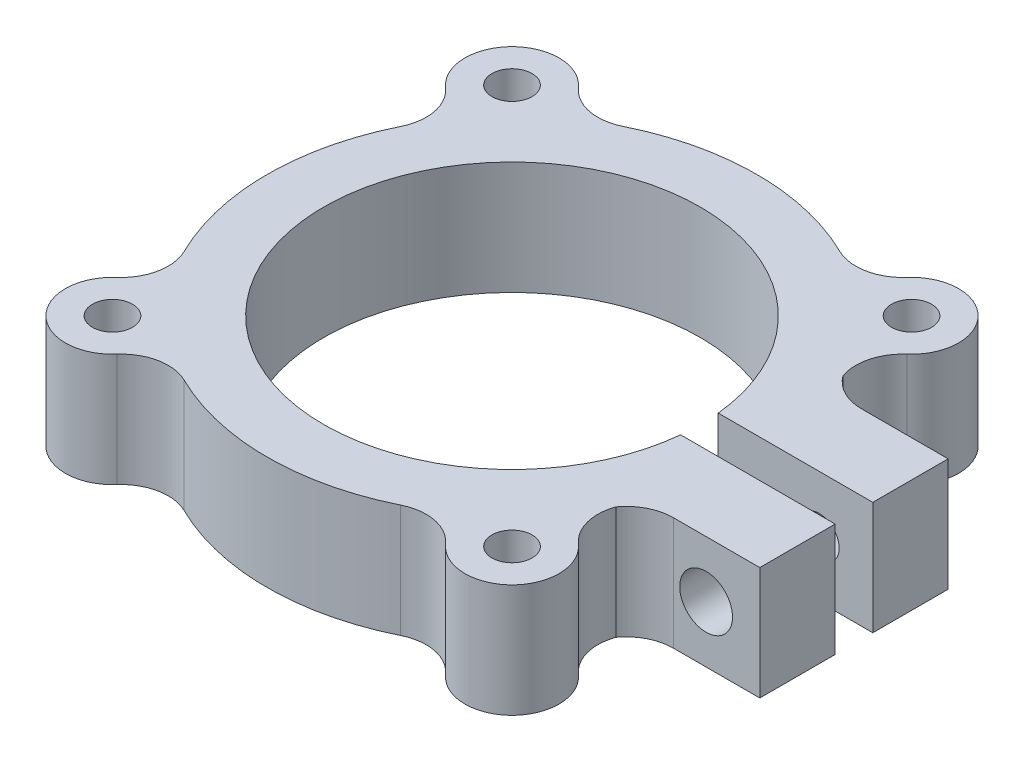
ISO-10303-21;
HEADER;
FILE_DESCRIPTION(('STEP AP214'),'2;1');
FILE_NAME('part.step','',(''),(''),'','','');
FILE_SCHEMA(('AUTOMOTIVE_DESIGN { 1 0 10303 214 1 1 1 1 }'));
ENDSEC;
DATA;
#1=APPLICATION_CONTEXT('core data for automotive mechanical design processes');
#2=APPLICATION_PROTOCOL_DEFINITION('international standard','automotive_design',2000,#1);
#3=PRODUCT_CONTEXT('',#1,'mechanical');
#4=PRODUCT('Part','Part','',(#3));
#5=PRODUCT_RELATED_PRODUCT_CATEGORY('part','',(#4));
#6=PRODUCT_DEFINITION_FORMATION('','',#4);
#7=PRODUCT_DEFINITION_CONTEXT('part definition',#1,'design');
#8=PRODUCT_DEFINITION('design','',#6,#7);
#9=PRODUCT_DEFINITION_SHAPE('','',#8);
#10=(LENGTH_UNIT() NAMED_UNIT(*) SI_UNIT(.MILLI.,.METRE.));
#11=(NAMED_UNIT(*) PLANE_ANGLE_UNIT() SI_UNIT($,.RADIAN.));
#12=(NAMED_UNIT(*) SI_UNIT($,.STERADIAN.) SOLID_ANGLE_UNIT());
#13=UNCERTAINTY_MEASURE_WITH_UNIT(LENGTH_MEASURE(1.E-05),#10,'distance_accuracy_value','');
#14=(GEOMETRIC_REPRESENTATION_CONTEXT(3) GLOBAL_UNCERTAINTY_ASSIGNED_CONTEXT((#13)) GLOBAL_UNIT_ASSIGNED_CONTEXT((#10,
#11,#12)) REPRESENTATION_CONTEXT('',''));
#15=CARTESIAN_POINT('',(0.,0.,0.));
#16=DIRECTION('',(0.,0.,1.));
#17=DIRECTION('',(1.,0.,0.));
#18=AXIS2_PLACEMENT_3D('',#15,#16,#17);
#19=CARTESIAN_POINT('',(23.0579604512541,7.62,-6.35));
#20=DIRECTION('',(1.,0.,0.));
#21=DIRECTION('',(0.,0.,-1.));
#22=AXIS2_PLACEMENT_3D('',#19,#20,#21);
#23=PLANE('',#22);
#24=DIRECTION('',(0.,1.,0.));
#25=VECTOR('',#24,1.);
#26=CARTESIAN_POINT('',(23.0579604512541,0.,1.27));
#27=LINE('',#26,#25);
#28=CARTESIAN_POINT('',(23.0579604512541,0.,1.27));
#29=VERTEX_POINT('',#28);
#30=CARTESIAN_POINT('',(23.0579604512541,7.62,1.27));
#31=VERTEX_POINT('',#30);
#32=EDGE_CURVE('E353',#29,#31,#27,.T.);
#33=ORIENTED_EDGE('',*,*,#32,.T.);
#34=DIRECTION('',(0.,0.,1.));
#35=VECTOR('',#34,1.);
#36=CARTESIAN_POINT('',(23.0579604512541,7.62,-6.35));
#37=LINE('',#36,#35);
#38=CARTESIAN_POINT('',(23.0579604512541,7.62,6.35));
#39=VERTEX_POINT('',#38);
#40=EDGE_CURVE('E377',#31,#39,#37,.T.);
#41=ORIENTED_EDGE('',*,*,#40,.T.);
#42=DIRECTION('',(0.,-1.,0.));
#43=VECTOR('',#42,1.);
#44=CARTESIAN_POINT('',(23.0579604512541,7.62,6.35));
#45=LINE('',#44,#43);
#46=CARTESIAN_POINT('',(23.0579604512541,0.,6.35));
#47=VERTEX_POINT('',#46);
#48=EDGE_CURVE('E305',#39,#47,#45,.T.);
#49=ORIENTED_EDGE('',*,*,#48,.T.);
#50=DIRECTION('',(0.,0.,1.));
#51=VECTOR('',#50,1.);
#52=CARTESIAN_POINT('',(23.0579604512541,0.,-6.35));
#53=LINE('',#52,#51);
#54=EDGE_CURVE('E224',#29,#47,#53,.T.);
#55=ORIENTED_EDGE('',*,*,#54,.F.);
#56=EDGE_LOOP('',(#33,#41,#49,#55));
#57=FACE_BOUND('',#56,.T.);
#58=ADVANCED_FACE('F33',(#57),#23,.T.);
#59=CARTESIAN_POINT('',(17.2271181571382,7.62,-9.525));
#60=DIRECTION('',(0.,-1.,0.));
#61=DIRECTION('',(0.,0.,-1.));
#62=AXIS2_PLACEMENT_3D('',#59,#60,#61);
#63=CYLINDRICAL_SURFACE('',#62,3.175);
#64=CARTESIAN_POINT('',(17.2271181571382,0.,-9.525));
#65=DIRECTION('',(0.,1.,0.));
#66=DIRECTION('',(0.,0.,1.));
#67=AXIS2_PLACEMENT_3D('',#64,#65,#66);
#68=CIRCLE('',#67,3.175);
#69=CARTESIAN_POINT('',(14.6594904855866,0.,-7.65740444949056));
#70=VERTEX_POINT('',#69);
#71=CARTESIAN_POINT('',(17.2271181571382,0.,-6.35));
#72=VERTEX_POINT('',#71);
#73=EDGE_CURVE('E217',#70,#72,#68,.T.);
#74=ORIENTED_EDGE('',*,*,#73,.F.);
#75=DIRECTION('',(0.,-1.,0.));
#76=VECTOR('',#75,1.);
#77=CARTESIAN_POINT('',(14.6594904855866,7.62,-7.65740444949056));
#78=LINE('',#77,#76);
#79=CARTESIAN_POINT('',(14.6594904855866,7.62,-7.65740444949056));
#80=VERTEX_POINT('',#79);
#81=EDGE_CURVE('E11',#80,#70,#78,.T.);
#82=ORIENTED_EDGE('',*,*,#81,.F.);
#83=CARTESIAN_POINT('',(17.2271181571382,7.62,-9.525));
#84=DIRECTION('',(0.,1.,0.));
#85=DIRECTION('',(0.,0.,1.));
#86=AXIS2_PLACEMENT_3D('',#83,#84,#85);
#87=CIRCLE('',#86,3.175);
#88=CARTESIAN_POINT('',(17.2271181571382,7.62,-6.35));
#89=VERTEX_POINT('',#88);
#90=EDGE_CURVE('E275',#80,#89,#87,.T.);
#91=ORIENTED_EDGE('',*,*,#90,.T.);
#92=DIRECTION('',(0.,-1.,0.));
#93=VECTOR('',#92,1.);
#94=CARTESIAN_POINT('',(17.2271181571382,7.62,-6.35));
#95=LINE('',#94,#93);
#96=EDGE_CURVE('E37',#89,#72,#95,.T.);
#97=ORIENTED_EDGE('',*,*,#96,.T.);
#98=EDGE_LOOP('',(#74,#82,#91,#97));
#99=FACE_BOUND('',#98,.T.);
#100=ADVANCED_FACE('F35',(#99),#63,.F.);
#101=CARTESIAN_POINT('',(17.6591584825056,7.62,-8.69789323283242));
#102=DIRECTION('',(0.,-1.,0.));
#103=DIRECTION('',(0.,0.,-1.));
#104=AXIS2_PLACEMENT_3D('',#101,#102,#103);
#105=CYLINDRICAL_SURFACE('',#104,3.175);
#106=CARTESIAN_POINT('',(17.6591584825056,0.,-8.69789323283242));
#107=DIRECTION('',(0.,1.,0.));
#108=DIRECTION('',(0.,0.,1.));
#109=AXIS2_PLACEMENT_3D('',#106,#107,#108);
#110=CIRCLE('',#109,3.175);
#111=CARTESIAN_POINT('',(15.5647713320546,0.,-11.0841387072181));
#112=VERTEX_POINT('',#111);
#113=EDGE_CURVE('E273',#112,#70,#110,.T.);
#114=ORIENTED_EDGE('',*,*,#113,.F.);
#115=DIRECTION('',(0.,-1.,0.));
#116=VECTOR('',#115,1.);
#117=CARTESIAN_POINT('',(15.5647713320546,7.62,-11.0841387072181));
#118=LINE('',#117,#116);
#119=CARTESIAN_POINT('',(15.5647713320546,7.62,-11.0841387072181));
#120=VERTEX_POINT('',#119);
#121=EDGE_CURVE('E42',#120,#112,#118,.T.);
#122=ORIENTED_EDGE('',*,*,#121,.F.);
#123=CARTESIAN_POINT('',(17.6591584825056,7.62,-8.69789323283242));
#124=DIRECTION('',(0.,1.,0.));
#125=DIRECTION('',(0.,0.,1.));
#126=AXIS2_PLACEMENT_3D('',#123,#124,#125);
#127=CIRCLE('',#126,3.175);
#128=EDGE_CURVE('E207',#120,#80,#127,.T.);
#129=ORIENTED_EDGE('',*,*,#128,.T.);
#130=ORIENTED_EDGE('',*,*,#81,.T.);
#131=EDGE_LOOP('',(#114,#122,#129,#130));
#132=FACE_BOUND('',#131,.T.);
#133=ADVANCED_FACE('F313',(#132),#105,.F.);
#134=CARTESIAN_POINT('',(13.4703841816037,7.62,-13.4703841816038));
#135=DIRECTION('',(0.,-1.,0.));
#136=DIRECTION('',(0.,0.,-1.));
#137=AXIS2_PLACEMENT_3D('',#134,#135,#136);
#138=CYLINDRICAL_SURFACE('',#137,3.17500000000001);
#139=CARTESIAN_POINT('',(13.4703841816037,0.,-13.4703841816038));
#140=DIRECTION('',(0.,-1.,0.));
#141=DIRECTION('',(0.,0.,-1.));
#142=AXIS2_PLACEMENT_3D('',#139,#140,#141);
#143=CIRCLE('',#142,3.17500000000001);
#144=CARTESIAN_POINT('',(11.084138707218,0.,-15.5647713320547));
#145=VERTEX_POINT('',#144);
#146=EDGE_CURVE('E193',#145,#112,#143,.T.);
#147=ORIENTED_EDGE('',*,*,#146,.F.);
#148=DIRECTION('',(0.,-1.,0.));
#149=VECTOR('',#148,1.);
#150=CARTESIAN_POINT('',(11.084138707218,7.62,-15.5647713320547));
#151=LINE('',#150,#149);
#152=CARTESIAN_POINT('',(11.084138707218,7.62,-15.5647713320547));
#153=VERTEX_POINT('',#152);
#154=EDGE_CURVE('E187',#153,#145,#151,.T.);
#155=ORIENTED_EDGE('',*,*,#154,.F.);
#156=CARTESIAN_POINT('',(13.4703841816037,7.62,-13.4703841816038));
#157=DIRECTION('',(0.,-1.,0.));
#158=DIRECTION('',(0.,0.,-1.));
#159=AXIS2_PLACEMENT_3D('',#156,#157,#158);
#160=CIRCLE('',#159,3.17500000000001);
#161=EDGE_CURVE('E190',#153,#120,#160,.T.);
#162=ORIENTED_EDGE('',*,*,#161,.T.);
#163=ORIENTED_EDGE('',*,*,#121,.T.);
#164=EDGE_LOOP('',(#147,#155,#162,#163));
#165=FACE_BOUND('',#164,.T.);
#166=ADVANCED_FACE('F189',(#165),#138,.T.);
#167=CARTESIAN_POINT('',(8.69789323283236,7.62,-17.6591584825056));
#168=DIRECTION('',(0.,-1.,0.));
#169=DIRECTION('',(0.,0.,-1.));
#170=AXIS2_PLACEMENT_3D('',#167,#168,#169);
#171=CYLINDRICAL_SURFACE('',#170,3.175);
#172=CARTESIAN_POINT('',(8.69789323283236,0.,-17.6591584825056));
#173=DIRECTION('',(0.,1.,0.));
#174=DIRECTION('',(0.,0.,1.));
#175=AXIS2_PLACEMENT_3D('',#172,#173,#174);
#176=CIRCLE('',#175,3.175);
#177=CARTESIAN_POINT('',(7.29500722753681,0.,-14.8109071143595));
#178=VERTEX_POINT('',#177);
#179=EDGE_CURVE('E270',#178,#145,#176,.T.);
#180=ORIENTED_EDGE('',*,*,#179,.F.);
#181=DIRECTION('',(0.,-1.,0.));
#182=VECTOR('',#181,1.);
#183=CARTESIAN_POINT('',(7.29500722753681,7.62,-14.8109071143595));
#184=LINE('',#183,#182);
#185=CARTESIAN_POINT('',(7.29500722753681,7.62,-14.8109071143595));
#186=VERTEX_POINT('',#185);
#187=EDGE_CURVE('E198',#186,#178,#184,.T.);
#188=ORIENTED_EDGE('',*,*,#187,.F.);
#189=CARTESIAN_POINT('',(8.69789323283236,7.62,-17.6591584825056));
#190=DIRECTION('',(0.,1.,0.));
#191=DIRECTION('',(0.,0.,1.));
#192=AXIS2_PLACEMENT_3D('',#189,#190,#191);
#193=CIRCLE('',#192,3.175);
#194=EDGE_CURVE('E205',#186,#153,#193,.T.);
#195=ORIENTED_EDGE('',*,*,#194,.T.);
#196=ORIENTED_EDGE('',*,*,#154,.T.);
#197=EDGE_LOOP('',(#180,#188,#195,#196));
#198=FACE_BOUND('',#197,.T.);
#199=ADVANCED_FACE('F209',(#198),#171,.F.);
#200=CARTESIAN_POINT('',(0.,7.62,0.));
#201=DIRECTION('',(0.,-1.,0.));
#202=DIRECTION('',(0.,0.,-1.));
#203=AXIS2_PLACEMENT_3D('',#200,#201,#202);
#204=CYLINDRICAL_SURFACE('',#203,16.51);
#205=CARTESIAN_POINT('',(0.,0.,0.));
#206=DIRECTION('',(0.,-1.,0.));
#207=DIRECTION('',(0.,0.,-1.));
#208=AXIS2_PLACEMENT_3D('',#205,#206,#207);
#209=CIRCLE('',#208,16.51);
#210=CARTESIAN_POINT('',(-7.29500722753686,0.,-14.8109071143595));
#211=VERTEX_POINT('',#210);
#212=EDGE_CURVE('E267',#211,#178,#209,.T.);
#213=ORIENTED_EDGE('',*,*,#212,.F.);
#214=DIRECTION('',(0.,-1.,0.));
#215=VECTOR('',#214,1.);
#216=CARTESIAN_POINT('',(-7.29500722753686,7.62,-14.8109071143595));
#217=LINE('',#216,#215);
#218=CARTESIAN_POINT('',(-7.29500722753686,7.62,-14.8109071143595));
#219=VERTEX_POINT('',#218);
#220=EDGE_CURVE('E279',#219,#211,#217,.T.);
#221=ORIENTED_EDGE('',*,*,#220,.F.);
#222=CARTESIAN_POINT('',(0.,7.62,0.));
#223=DIRECTION('',(0.,-1.,0.));
#224=DIRECTION('',(0.,0.,-1.));
#225=AXIS2_PLACEMENT_3D('',#222,#223,#224);
#226=CIRCLE('',#225,16.51);
#227=EDGE_CURVE('E210',#219,#186,#226,.T.);
#228=ORIENTED_EDGE('',*,*,#227,.T.);
#229=ORIENTED_EDGE('',*,*,#187,.T.);
#230=EDGE_LOOP('',(#213,#221,#228,#229));
#231=FACE_BOUND('',#230,.T.);
#232=ADVANCED_FACE('F477',(#231),#204,.T.);
#233=CARTESIAN_POINT('',(-8.6978932328324,7.62,-17.6591584825056));
#234=DIRECTION('',(0.,-1.,0.));
#235=DIRECTION('',(0.,0.,-1.));
#236=AXIS2_PLACEMENT_3D('',#233,#234,#235);
#237=CYLINDRICAL_SURFACE('',#236,3.175);
#238=CARTESIAN_POINT('',(-8.6978932328324,0.,-17.6591584825056));
#239=DIRECTION('',(0.,1.,0.));
#240=DIRECTION('',(0.,0.,1.));
#241=AXIS2_PLACEMENT_3D('',#238,#239,#240);
#242=CIRCLE('',#241,3.175);
#243=CARTESIAN_POINT('',(-11.0841387072181,0.,-15.5647713320546));
#244=VERTEX_POINT('',#243);
#245=EDGE_CURVE('E264',#244,#211,#242,.T.);
#246=ORIENTED_EDGE('',*,*,#245,.F.);
#247=DIRECTION('',(0.,-1.,0.));
#248=VECTOR('',#247,1.);
#249=CARTESIAN_POINT('',(-11.0841387072181,7.62,-15.5647713320546));
#250=LINE('',#249,#248);
#251=CARTESIAN_POINT('',(-11.0841387072181,7.62,-15.5647713320546));
#252=VERTEX_POINT('',#251);
#253=EDGE_CURVE('E281',#252,#244,#250,.T.);
#254=ORIENTED_EDGE('',*,*,#253,.F.);
#255=CARTESIAN_POINT('',(-8.6978932328324,7.62,-17.6591584825056));
#256=DIRECTION('',(0.,1.,0.));
#257=DIRECTION('',(0.,0.,1.));
#258=AXIS2_PLACEMENT_3D('',#255,#256,#257);
#259=CIRCLE('',#258,3.175);
#260=EDGE_CURVE('E212',#252,#219,#259,.T.);
#261=ORIENTED_EDGE('',*,*,#260,.T.);
#262=ORIENTED_EDGE('',*,*,#220,.T.);
#263=EDGE_LOOP('',(#246,#254,#261,#262));
#264=FACE_BOUND('',#263,.T.);
#265=ADVANCED_FACE('F418',(#264),#237,.F.);
#266=CARTESIAN_POINT('',(-13.4703841816037,7.62,-13.4703841816037));
#267=DIRECTION('',(0.,-1.,0.));
#268=DIRECTION('',(0.,0.,-1.));
#269=AXIS2_PLACEMENT_3D('',#266,#267,#268);
#270=CYLINDRICAL_SURFACE('',#269,3.17500000000001);
#271=CARTESIAN_POINT('',(-13.4703841816037,0.,-13.4703841816037));
#272=DIRECTION('',(0.,-1.,0.));
#273=DIRECTION('',(0.,0.,-1.));
#274=AXIS2_PLACEMENT_3D('',#271,#272,#273);
#275=CIRCLE('',#274,3.17500000000001);
#276=CARTESIAN_POINT('',(-15.5647713320547,0.,-11.084138707218));
#277=VERTEX_POINT('',#276);
#278=EDGE_CURVE('E261',#277,#244,#275,.T.);
#279=ORIENTED_EDGE('',*,*,#278,.F.);
#280=DIRECTION('',(0.,-1.,0.));
#281=VECTOR('',#280,1.);
#282=CARTESIAN_POINT('',(-15.5647713320547,7.62,-11.084138707218));
#283=LINE('',#282,#281);
#284=CARTESIAN_POINT('',(-15.5647713320547,7.62,-11.084138707218));
#285=VERTEX_POINT('',#284);
#286=EDGE_CURVE('E283',#285,#277,#283,.T.);
#287=ORIENTED_EDGE('',*,*,#286,.F.);
#288=CARTESIAN_POINT('',(-13.4703841816037,7.62,-13.4703841816037));
#289=DIRECTION('',(0.,-1.,0.));
#290=DIRECTION('',(0.,0.,-1.));
#291=AXIS2_PLACEMENT_3D('',#288,#289,#290);
#292=CIRCLE('',#291,3.17500000000001);
#293=EDGE_CURVE('E412',#285,#252,#292,.T.);
#294=ORIENTED_EDGE('',*,*,#293,.T.);
#295=ORIENTED_EDGE('',*,*,#253,.T.);
#296=EDGE_LOOP('',(#279,#287,#294,#295));
#297=FACE_BOUND('',#296,.T.);
#298=ADVANCED_FACE('F424',(#297),#270,.T.);
#299=CARTESIAN_POINT('',(-17.6591584825056,7.62,-8.69789323283237));
#300=DIRECTION('',(0.,-1.,0.));
#301=DIRECTION('',(0.,0.,-1.));
#302=AXIS2_PLACEMENT_3D('',#299,#300,#301);
#303=CYLINDRICAL_SURFACE('',#302,3.175);
#304=CARTESIAN_POINT('',(-17.6591584825056,0.,-8.69789323283237));
#305=DIRECTION('',(0.,1.,0.));
#306=DIRECTION('',(0.,0.,1.));
#307=AXIS2_PLACEMENT_3D('',#304,#305,#306);
#308=CIRCLE('',#307,3.175);
#309=CARTESIAN_POINT('',(-14.8109071143595,0.,-7.29500722753682));
#310=VERTEX_POINT('',#309);
#311=EDGE_CURVE('E258',#310,#277,#308,.T.);
#312=ORIENTED_EDGE('',*,*,#311,.F.);
#313=DIRECTION('',(0.,-1.,0.));
#314=VECTOR('',#313,1.);
#315=CARTESIAN_POINT('',(-14.8109071143595,7.62,-7.29500722753682));
#316=LINE('',#315,#314);
#317=CARTESIAN_POINT('',(-14.8109071143595,7.62,-7.29500722753682));
#318=VERTEX_POINT('',#317);
#319=EDGE_CURVE('E285',#318,#310,#316,.T.);
#320=ORIENTED_EDGE('',*,*,#319,.F.);
#321=CARTESIAN_POINT('',(-17.6591584825056,7.62,-8.69789323283237));
#322=DIRECTION('',(0.,1.,0.));
#323=DIRECTION('',(0.,0.,1.));
#324=AXIS2_PLACEMENT_3D('',#321,#322,#323);
#325=CIRCLE('',#324,3.175);
#326=EDGE_CURVE('E409',#318,#285,#325,.T.);
#327=ORIENTED_EDGE('',*,*,#326,.T.);
#328=ORIENTED_EDGE('',*,*,#286,.T.);
#329=EDGE_LOOP('',(#312,#320,#327,#328));
#330=FACE_BOUND('',#329,.T.);
#331=ADVANCED_FACE('F427',(#330),#303,.F.);
#332=CARTESIAN_POINT('',(0.,7.62,0.));
#333=DIRECTION('',(0.,-1.,0.));
#334=DIRECTION('',(0.,0.,-1.));
#335=AXIS2_PLACEMENT_3D('',#332,#333,#334);
#336=CYLINDRICAL_SURFACE('',#335,16.51);
#337=CARTESIAN_POINT('',(0.,0.,0.));
#338=DIRECTION('',(0.,-1.,0.));
#339=DIRECTION('',(0.,0.,-1.));
#340=AXIS2_PLACEMENT_3D('',#337,#338,#339);
#341=CIRCLE('',#340,16.51);
#342=CARTESIAN_POINT('',(-14.8109071143595,0.,7.29500722753685));
#343=VERTEX_POINT('',#342);
#344=EDGE_CURVE('E255',#343,#310,#341,.T.);
#345=ORIENTED_EDGE('',*,*,#344,.F.);
#346=DIRECTION('',(0.,-1.,0.));
#347=VECTOR('',#346,1.);
#348=CARTESIAN_POINT('',(-14.8109071143595,7.62,7.29500722753685));
#349=LINE('',#348,#347);
#350=CARTESIAN_POINT('',(-14.8109071143595,7.62,7.29500722753685));
#351=VERTEX_POINT('',#350);
#352=EDGE_CURVE('E287',#351,#343,#349,.T.);
#353=ORIENTED_EDGE('',*,*,#352,.F.);
#354=CARTESIAN_POINT('',(0.,7.62,0.));
#355=DIRECTION('',(0.,-1.,0.));
#356=DIRECTION('',(0.,0.,-1.));
#357=AXIS2_PLACEMENT_3D('',#354,#355,#356);
#358=CIRCLE('',#357,16.51);
#359=EDGE_CURVE('E406',#351,#318,#358,.T.);
#360=ORIENTED_EDGE('',*,*,#359,.T.);
#361=ORIENTED_EDGE('',*,*,#319,.T.);
#362=EDGE_LOOP('',(#345,#353,#360,#361));
#363=FACE_BOUND('',#362,.T.);
#364=ADVANCED_FACE('F432',(#363),#336,.T.);
#365=CARTESIAN_POINT('',(-17.6591584825056,7.62,8.6978932328324));
#366=DIRECTION('',(0.,-1.,0.));
#367=DIRECTION('',(0.,0.,-1.));
#368=AXIS2_PLACEMENT_3D('',#365,#366,#367);
#369=CYLINDRICAL_SURFACE('',#368,3.175);
#370=CARTESIAN_POINT('',(-17.6591584825056,0.,8.6978932328324));
#371=DIRECTION('',(0.,1.,0.));
#372=DIRECTION('',(0.,0.,1.));
#373=AXIS2_PLACEMENT_3D('',#370,#371,#372);
#374=CIRCLE('',#373,3.175);
#375=CARTESIAN_POINT('',(-15.5647713320547,0.,11.0841387072181));
#376=VERTEX_POINT('',#375);
#377=EDGE_CURVE('E252',#376,#343,#374,.T.);
#378=ORIENTED_EDGE('',*,*,#377,.F.);
#379=DIRECTION('',(0.,-1.,0.));
#380=VECTOR('',#379,1.);
#381=CARTESIAN_POINT('',(-15.5647713320547,7.62,11.0841387072181));
#382=LINE('',#381,#380);
#383=CARTESIAN_POINT('',(-15.5647713320547,7.62,11.0841387072181));
#384=VERTEX_POINT('',#383);
#385=EDGE_CURVE('E289',#384,#376,#382,.T.);
#386=ORIENTED_EDGE('',*,*,#385,.F.);
#387=CARTESIAN_POINT('',(-17.6591584825056,7.62,8.6978932328324));
#388=DIRECTION('',(0.,1.,0.));
#389=DIRECTION('',(0.,0.,1.));
#390=AXIS2_PLACEMENT_3D('',#387,#388,#389);
#391=CIRCLE('',#390,3.175);
#392=EDGE_CURVE('E403',#384,#351,#391,.T.);
#393=ORIENTED_EDGE('',*,*,#392,.T.);
#394=ORIENTED_EDGE('',*,*,#352,.T.);
#395=EDGE_LOOP('',(#378,#386,#393,#394));
#396=FACE_BOUND('',#395,.T.);
#397=ADVANCED_FACE('F435',(#396),#369,.F.);
#398=CARTESIAN_POINT('',(-13.4703841816037,7.62,13.4703841816037));
#399=DIRECTION('',(0.,-1.,0.));
#400=DIRECTION('',(0.,0.,-1.));
#401=AXIS2_PLACEMENT_3D('',#398,#399,#400);
#402=CYLINDRICAL_SURFACE('',#401,3.17500000000001);
#403=CARTESIAN_POINT('',(-13.4703841816037,0.,13.4703841816037));
#404=DIRECTION('',(0.,-1.,0.));
#405=DIRECTION('',(0.,0.,-1.));
#406=AXIS2_PLACEMENT_3D('',#403,#404,#405);
#407=CIRCLE('',#406,3.17500000000001);
#408=CARTESIAN_POINT('',(-11.0841387072181,0.,15.5647713320547));
#409=VERTEX_POINT('',#408);
#410=EDGE_CURVE('E249',#409,#376,#407,.T.);
#411=ORIENTED_EDGE('',*,*,#410,.F.);
#412=DIRECTION('',(0.,-1.,0.));
#413=VECTOR('',#412,1.);
#414=CARTESIAN_POINT('',(-11.0841387072181,7.62,15.5647713320547));
#415=LINE('',#414,#413);
#416=CARTESIAN_POINT('',(-11.0841387072181,7.62,15.5647713320547));
#417=VERTEX_POINT('',#416);
#418=EDGE_CURVE('E291',#417,#409,#415,.T.);
#419=ORIENTED_EDGE('',*,*,#418,.F.);
#420=CARTESIAN_POINT('',(-13.4703841816037,7.62,13.4703841816037));
#421=DIRECTION('',(0.,-1.,0.));
#422=DIRECTION('',(0.,0.,-1.));
#423=AXIS2_PLACEMENT_3D('',#420,#421,#422);
#424=CIRCLE('',#423,3.17500000000001);
#425=EDGE_CURVE('E400',#417,#384,#424,.T.);
#426=ORIENTED_EDGE('',*,*,#425,.T.);
#427=ORIENTED_EDGE('',*,*,#385,.T.);
#428=EDGE_LOOP('',(#411,#419,#426,#427));
#429=FACE_BOUND('',#428,.T.);
#430=ADVANCED_FACE('F440',(#429),#402,.T.);
#431=CARTESIAN_POINT('',(-8.69789323283238,7.62,17.6591584825056));
#432=DIRECTION('',(0.,-1.,0.));
#433=DIRECTION('',(0.,0.,-1.));
#434=AXIS2_PLACEMENT_3D('',#431,#432,#433);
#435=CYLINDRICAL_SURFACE('',#434,3.175);
#436=CARTESIAN_POINT('',(-8.69789323283238,0.,17.6591584825056));
#437=DIRECTION('',(0.,1.,0.));
#438=DIRECTION('',(0.,0.,1.));
#439=AXIS2_PLACEMENT_3D('',#436,#437,#438);
#440=CIRCLE('',#439,3.175);
#441=CARTESIAN_POINT('',(-7.29500722753683,0.,14.8109071143595));
#442=VERTEX_POINT('',#441);
#443=EDGE_CURVE('E246',#442,#409,#440,.T.);
#444=ORIENTED_EDGE('',*,*,#443,.F.);
#445=DIRECTION('',(0.,-1.,0.));
#446=VECTOR('',#445,1.);
#447=CARTESIAN_POINT('',(-7.29500722753683,7.62,14.8109071143595));
#448=LINE('',#447,#446);
#449=CARTESIAN_POINT('',(-7.29500722753683,7.62,14.8109071143595));
#450=VERTEX_POINT('',#449);
#451=EDGE_CURVE('E293',#450,#442,#448,.T.);
#452=ORIENTED_EDGE('',*,*,#451,.F.);
#453=CARTESIAN_POINT('',(-8.69789323283238,7.62,17.6591584825056));
#454=DIRECTION('',(0.,1.,0.));
#455=DIRECTION('',(0.,0.,1.));
#456=AXIS2_PLACEMENT_3D('',#453,#454,#455);
#457=CIRCLE('',#456,3.175);
#458=EDGE_CURVE('E397',#450,#417,#457,.T.);
#459=ORIENTED_EDGE('',*,*,#458,.T.);
#460=ORIENTED_EDGE('',*,*,#418,.T.);
#461=EDGE_LOOP('',(#444,#452,#459,#460));
#462=FACE_BOUND('',#461,.T.);
#463=ADVANCED_FACE('F443',(#462),#435,.F.);
#464=CARTESIAN_POINT('',(0.,7.62,0.));
#465=DIRECTION('',(0.,-1.,0.));
#466=DIRECTION('',(0.,0.,-1.));
#467=AXIS2_PLACEMENT_3D('',#464,#465,#466);
#468=CYLINDRICAL_SURFACE('',#467,16.51);
#469=CARTESIAN_POINT('',(0.,0.,0.));
#470=DIRECTION('',(0.,-1.,0.));
#471=DIRECTION('',(0.,0.,-1.));
#472=AXIS2_PLACEMENT_3D('',#469,#470,#471);
#473=CIRCLE('',#472,16.51);
#474=CARTESIAN_POINT('',(7.29500722753684,0.,14.8109071143595));
#475=VERTEX_POINT('',#474);
#476=EDGE_CURVE('E243',#475,#442,#473,.T.);
#477=ORIENTED_EDGE('',*,*,#476,.F.);
#478=DIRECTION('',(0.,-1.,0.));
#479=VECTOR('',#478,1.);
#480=CARTESIAN_POINT('',(7.29500722753684,7.62,14.8109071143595));
#481=LINE('',#480,#479);
#482=CARTESIAN_POINT('',(7.29500722753684,7.62,14.8109071143595));
#483=VERTEX_POINT('',#482);
#484=EDGE_CURVE('E295',#483,#475,#481,.T.);
#485=ORIENTED_EDGE('',*,*,#484,.F.);
#486=CARTESIAN_POINT('',(0.,7.62,0.));
#487=DIRECTION('',(0.,-1.,0.));
#488=DIRECTION('',(0.,0.,-1.));
#489=AXIS2_PLACEMENT_3D('',#486,#487,#488);
#490=CIRCLE('',#489,16.51);
#491=EDGE_CURVE('E394',#483,#450,#490,.T.);
#492=ORIENTED_EDGE('',*,*,#491,.T.);
#493=ORIENTED_EDGE('',*,*,#451,.T.);
#494=EDGE_LOOP('',(#477,#485,#492,#493));
#495=FACE_BOUND('',#494,.T.);
#496=ADVANCED_FACE('F448',(#495),#468,.T.);
#497=CARTESIAN_POINT('',(8.69789323283239,7.62,17.6591584825056));
#498=DIRECTION('',(0.,-1.,0.));
#499=DIRECTION('',(0.,0.,-1.));
#500=AXIS2_PLACEMENT_3D('',#497,#498,#499);
#501=CYLINDRICAL_SURFACE('',#500,3.175);
#502=CARTESIAN_POINT('',(8.69789323283239,0.,17.6591584825056));
#503=DIRECTION('',(0.,1.,0.));
#504=DIRECTION('',(0.,0.,1.));
#505=AXIS2_PLACEMENT_3D('',#502,#503,#504);
#506=CIRCLE('',#505,3.175);
#507=CARTESIAN_POINT('',(11.0841387072181,0.,15.5647713320547));
#508=VERTEX_POINT('',#507);
#509=EDGE_CURVE('E240',#508,#475,#506,.T.);
#510=ORIENTED_EDGE('',*,*,#509,.F.);
#511=DIRECTION('',(0.,-1.,0.));
#512=VECTOR('',#511,1.);
#513=CARTESIAN_POINT('',(11.0841387072181,7.62,15.5647713320547));
#514=LINE('',#513,#512);
#515=CARTESIAN_POINT('',(11.0841387072181,7.62,15.5647713320547));
#516=VERTEX_POINT('',#515);
#517=EDGE_CURVE('E297',#516,#508,#514,.T.);
#518=ORIENTED_EDGE('',*,*,#517,.F.);
#519=CARTESIAN_POINT('',(8.69789323283239,7.62,17.6591584825056));
#520=DIRECTION('',(0.,1.,0.));
#521=DIRECTION('',(0.,0.,1.));
#522=AXIS2_PLACEMENT_3D('',#519,#520,#521);
#523=CIRCLE('',#522,3.175);
#524=EDGE_CURVE('E391',#516,#483,#523,.T.);
#525=ORIENTED_EDGE('',*,*,#524,.T.);
#526=ORIENTED_EDGE('',*,*,#484,.T.);
#527=EDGE_LOOP('',(#510,#518,#525,#526));
#528=FACE_BOUND('',#527,.T.);
#529=ADVANCED_FACE('F451',(#528),#501,.F.);
#530=CARTESIAN_POINT('',(13.4703841816037,7.62,13.4703841816037));
#531=DIRECTION('',(0.,-1.,0.));
#532=DIRECTION('',(0.,0.,-1.));
#533=AXIS2_PLACEMENT_3D('',#530,#531,#532);
#534=CYLINDRICAL_SURFACE('',#533,3.17500000000001);
#535=CARTESIAN_POINT('',(13.4703841816037,0.,13.4703841816037));
#536=DIRECTION('',(0.,-1.,0.));
#537=DIRECTION('',(0.,0.,-1.));
#538=AXIS2_PLACEMENT_3D('',#535,#536,#537);
#539=CIRCLE('',#538,3.17500000000001);
#540=CARTESIAN_POINT('',(15.5647713320547,0.,11.0841387072181));
#541=VERTEX_POINT('',#540);
#542=EDGE_CURVE('E237',#541,#508,#539,.T.);
#543=ORIENTED_EDGE('',*,*,#542,.F.);
#544=DIRECTION('',(0.,-1.,0.));
#545=VECTOR('',#544,1.);
#546=CARTESIAN_POINT('',(15.5647713320547,7.62,11.0841387072181));
#547=LINE('',#546,#545);
#548=CARTESIAN_POINT('',(15.5647713320547,7.62,11.0841387072181));
#549=VERTEX_POINT('',#548);
#550=EDGE_CURVE('E299',#549,#541,#547,.T.);
#551=ORIENTED_EDGE('',*,*,#550,.F.);
#552=CARTESIAN_POINT('',(13.4703841816037,7.62,13.4703841816037));
#553=DIRECTION('',(0.,-1.,0.));
#554=DIRECTION('',(0.,0.,-1.));
#555=AXIS2_PLACEMENT_3D('',#552,#553,#554);
#556=CIRCLE('',#555,3.17500000000001);
#557=EDGE_CURVE('E388',#549,#516,#556,.T.);
#558=ORIENTED_EDGE('',*,*,#557,.T.);
#559=ORIENTED_EDGE('',*,*,#517,.T.);
#560=EDGE_LOOP('',(#543,#551,#558,#559));
#561=FACE_BOUND('',#560,.T.);
#562=ADVANCED_FACE('F456',(#561),#534,.T.);
#563=CARTESIAN_POINT('',(17.6591584825056,7.62,8.69789323283239));
#564=DIRECTION('',(0.,-1.,0.));
#565=DIRECTION('',(0.,0.,-1.));
#566=AXIS2_PLACEMENT_3D('',#563,#564,#565);
#567=CYLINDRICAL_SURFACE('',#566,3.175);
#568=CARTESIAN_POINT('',(17.6591584825056,0.,8.69789323283239));
#569=DIRECTION('',(0.,1.,0.));
#570=DIRECTION('',(0.,0.,1.));
#571=AXIS2_PLACEMENT_3D('',#568,#569,#570);
#572=CIRCLE('',#571,3.175);
#573=CARTESIAN_POINT('',(14.6594904855866,0.,7.65740444949056));
#574=VERTEX_POINT('',#573);
#575=EDGE_CURVE('E234',#574,#541,#572,.T.);
#576=ORIENTED_EDGE('',*,*,#575,.F.);
#577=DIRECTION('',(0.,-1.,0.));
#578=VECTOR('',#577,1.);
#579=CARTESIAN_POINT('',(14.6594904855866,7.62,7.65740444949056));
#580=LINE('',#579,#578);
#581=CARTESIAN_POINT('',(14.6594904855866,7.62,7.65740444949056));
#582=VERTEX_POINT('',#581);
#583=EDGE_CURVE('E301',#582,#574,#580,.T.);
#584=ORIENTED_EDGE('',*,*,#583,.F.);
#585=CARTESIAN_POINT('',(17.6591584825056,7.62,8.69789323283239));
#586=DIRECTION('',(0.,1.,0.));
#587=DIRECTION('',(0.,0.,1.));
#588=AXIS2_PLACEMENT_3D('',#585,#586,#587);
#589=CIRCLE('',#588,3.175);
#590=EDGE_CURVE('E385',#582,#549,#589,.T.);
#591=ORIENTED_EDGE('',*,*,#590,.T.);
#592=ORIENTED_EDGE('',*,*,#550,.T.);
#593=EDGE_LOOP('',(#576,#584,#591,#592));
#594=FACE_BOUND('',#593,.T.);
#595=ADVANCED_FACE('F459',(#594),#567,.F.);
#596=CARTESIAN_POINT('',(17.2271181571382,7.62,9.525));
#597=DIRECTION('',(0.,-1.,0.));
#598=DIRECTION('',(0.,0.,-1.));
#599=AXIS2_PLACEMENT_3D('',#596,#597,#598);
#600=CYLINDRICAL_SURFACE('',#599,3.175);
#601=CARTESIAN_POINT('',(17.2271181571382,0.,9.525));
#602=DIRECTION('',(0.,1.,0.));
#603=DIRECTION('',(0.,0.,1.));
#604=AXIS2_PLACEMENT_3D('',#601,#602,#603);
#605=CIRCLE('',#604,3.175);
#606=CARTESIAN_POINT('',(17.2271181571382,0.,6.35));
#607=VERTEX_POINT('',#606);
#608=EDGE_CURVE('E231',#607,#574,#605,.T.);
#609=ORIENTED_EDGE('',*,*,#608,.F.);
#610=DIRECTION('',(0.,-1.,0.));
#611=VECTOR('',#610,1.);
#612=CARTESIAN_POINT('',(17.2271181571382,7.62,6.35));
#613=LINE('',#612,#611);
#614=CARTESIAN_POINT('',(17.2271181571382,7.62,6.35));
#615=VERTEX_POINT('',#614);
#616=EDGE_CURVE('E303',#615,#607,#613,.T.);
#617=ORIENTED_EDGE('',*,*,#616,.F.);
#618=CARTESIAN_POINT('',(17.2271181571382,7.62,9.525));
#619=DIRECTION('',(0.,1.,0.));
#620=DIRECTION('',(0.,0.,1.));
#621=AXIS2_PLACEMENT_3D('',#618,#619,#620);
#622=CIRCLE('',#621,3.175);
#623=EDGE_CURVE('E382',#615,#582,#622,.T.);
#624=ORIENTED_EDGE('',*,*,#623,.T.);
#625=ORIENTED_EDGE('',*,*,#583,.T.);
#626=EDGE_LOOP('',(#609,#617,#624,#625));
#627=FACE_BOUND('',#626,.T.);
#628=ADVANCED_FACE('F338',(#627),#600,.F.);
#629=CARTESIAN_POINT('',(23.0579604512541,7.62,6.35));
#630=DIRECTION('',(0.,0.,1.));
#631=DIRECTION('',(1.,0.,0.));
#632=AXIS2_PLACEMENT_3D('',#629,#630,#631);
#633=PLANE('',#632);
#634=CARTESIAN_POINT('',(19.4387931912541,3.81,6.35000000000001));
#635=DIRECTION('',(0.,0.,1.));
#636=DIRECTION('',(1.,0.,0.));
#637=AXIS2_PLACEMENT_3D('',#634,#635,#636);
#638=CIRCLE('',#637,1.77799999999998);
#639=CARTESIAN_POINT('',(21.2167931912541,3.81,6.35000000000001));
#640=VERTEX_POINT('',#639);
#641=EDGE_CURVE('E643',#640,#640,#638,.T.);
#642=ORIENTED_EDGE('',*,*,#641,.F.);
#643=EDGE_LOOP('',(#642));
#644=FACE_BOUND('',#643,.T.);
#645=DIRECTION('',(-1.,0.,0.));
#646=VECTOR('',#645,1.);
#647=CARTESIAN_POINT('',(23.0579604512541,0.,6.35));
#648=LINE('',#647,#646);
#649=EDGE_CURVE('E228',#47,#607,#648,.T.);
#650=ORIENTED_EDGE('',*,*,#649,.F.);
#651=ORIENTED_EDGE('',*,*,#48,.F.);
#652=DIRECTION('',(-1.,0.,0.));
#653=VECTOR('',#652,1.);
#654=CARTESIAN_POINT('',(23.0579604512541,7.62,6.35));
#655=LINE('',#654,#653);
#656=EDGE_CURVE('E379',#39,#615,#655,.T.);
#657=ORIENTED_EDGE('',*,*,#656,.T.);
#658=ORIENTED_EDGE('',*,*,#616,.T.);
#659=EDGE_LOOP('',(#650,#651,#657,#658));
#660=FACE_BOUND('',#659,.T.);
#661=ADVANCED_FACE('F331',(#644,#660),#633,.T.);
#662=DIRECTION('',(0.,1.,0.));
#663=VECTOR('',#662,1.);
#664=CARTESIAN_POINT('',(23.0579604512541,0.,-1.27));
#665=LINE('',#664,#663);
#666=CARTESIAN_POINT('',(23.0579604512541,0.,-1.27));
#667=VERTEX_POINT('',#666);
#668=CARTESIAN_POINT('',(23.0579604512541,7.62,-1.27));
#669=VERTEX_POINT('',#668);
#670=EDGE_CURVE('E343',#667,#669,#665,.T.);
#671=ORIENTED_EDGE('',*,*,#670,.F.);
#672=CARTESIAN_POINT('',(23.0579604512541,0.,-6.35));
#673=VERTEX_POINT('',#672);
#674=EDGE_CURVE('E225',#673,#667,#53,.T.);
#675=ORIENTED_EDGE('',*,*,#674,.F.);
#676=DIRECTION('',(0.,-1.,0.));
#677=VECTOR('',#676,1.);
#678=CARTESIAN_POINT('',(23.0579604512541,7.62,-6.35));
#679=LINE('',#678,#677);
#680=CARTESIAN_POINT('',(23.0579604512541,7.62,-6.35));
#681=VERTEX_POINT('',#680);
#682=EDGE_CURVE('E307',#681,#673,#679,.T.);
#683=ORIENTED_EDGE('',*,*,#682,.F.);
#684=EDGE_CURVE('E345',#681,#669,#37,.T.);
#685=ORIENTED_EDGE('',*,*,#684,.T.);
#686=EDGE_LOOP('',(#671,#675,#683,#685));
#687=FACE_BOUND('',#686,.T.);
#688=ADVANCED_FACE('F325',(#687),#23,.T.);
#689=CARTESIAN_POINT('',(17.2271181571382,7.62,-6.35));
#690=DIRECTION('',(0.,0.,-1.));
#691=DIRECTION('',(-1.,0.,0.));
#692=AXIS2_PLACEMENT_3D('',#689,#690,#691);
#693=PLANE('',#692);
#694=CARTESIAN_POINT('',(19.4387931912541,3.81,-6.35));
#695=DIRECTION('',(0.,0.,-1.));
#696=DIRECTION('',(-1.,0.,0.));
#697=AXIS2_PLACEMENT_3D('',#694,#695,#696);
#698=CIRCLE('',#697,1.35254999999998);
#699=CARTESIAN_POINT('',(18.0862431912541,3.81,-6.35));
#700=VERTEX_POINT('',#699);
#701=EDGE_CURVE('E646',#700,#700,#698,.T.);
#702=ORIENTED_EDGE('',*,*,#701,.F.);
#703=EDGE_LOOP('',(#702));
#704=FACE_BOUND('',#703,.T.);
#705=DIRECTION('',(1.,0.,0.));
#706=VECTOR('',#705,1.);
#707=CARTESIAN_POINT('',(17.2271181571382,0.,-6.35));
#708=LINE('',#707,#706);
#709=EDGE_CURVE('E220',#72,#673,#708,.T.);
#710=ORIENTED_EDGE('',*,*,#709,.F.);
#711=ORIENTED_EDGE('',*,*,#96,.F.);
#712=DIRECTION('',(1.,0.,0.));
#713=VECTOR('',#712,1.);
#714=CARTESIAN_POINT('',(17.2271181571382,7.62,-6.35));
#715=LINE('',#714,#713);
#716=EDGE_CURVE('E375',#89,#681,#715,.T.);
#717=ORIENTED_EDGE('',*,*,#716,.T.);
#718=ORIENTED_EDGE('',*,*,#682,.T.);
#719=EDGE_LOOP('',(#710,#711,#717,#718));
#720=FACE_BOUND('',#719,.T.);
#721=ADVANCED_FACE('F309',(#704,#720),#693,.T.);
#722=CARTESIAN_POINT('',(17.2271181571382,7.62,-9.525));
#723=DIRECTION('',(0.,1.,0.));
#724=DIRECTION('',(0.,0.,1.));
#725=AXIS2_PLACEMENT_3D('',#722,#723,#724);
#726=PLANE('',#725);
#727=CARTESIAN_POINT('',(13.4703841816039,7.62,13.4703841816037));
#728=DIRECTION('',(0.,-1.,0.));
#729=DIRECTION('',(0.,0.,-1.));
#730=AXIS2_PLACEMENT_3D('',#727,#728,#729);
#731=CIRCLE('',#730,1.35254999999998);
#732=CARTESIAN_POINT('',(13.4703841816039,7.62,12.1178341816037));
#733=VERTEX_POINT('',#732);
#734=EDGE_CURVE('E636',#733,#733,#731,.T.);
#735=ORIENTED_EDGE('',*,*,#734,.T.);
#736=EDGE_LOOP('',(#735));
#737=FACE_BOUND('',#736,.T.);
#738=CARTESIAN_POINT('',(-13.4703841816038,7.62,13.4703841816037));
#739=DIRECTION('',(0.,-1.,0.));
#740=DIRECTION('',(0.,0.,-1.));
#741=AXIS2_PLACEMENT_3D('',#738,#739,#740);
#742=CIRCLE('',#741,1.35254999999998);
#743=CARTESIAN_POINT('',(-13.4703841816038,7.62,12.1178341816038));
#744=VERTEX_POINT('',#743);
#745=EDGE_CURVE('E632',#744,#744,#742,.T.);
#746=ORIENTED_EDGE('',*,*,#745,.T.);
#747=EDGE_LOOP('',(#746));
#748=FACE_BOUND('',#747,.T.);
#749=CARTESIAN_POINT('',(-13.4703841816038,7.62,-13.4703841816038));
#750=DIRECTION('',(0.,-1.,0.));
#751=DIRECTION('',(0.,0.,-1.));
#752=AXIS2_PLACEMENT_3D('',#749,#750,#751);
#753=CIRCLE('',#752,1.35254999999998);
#754=CARTESIAN_POINT('',(-13.4703841816038,7.62,-14.8229341816038));
#755=VERTEX_POINT('',#754);
#756=EDGE_CURVE('E618',#755,#755,#753,.T.);
#757=ORIENTED_EDGE('',*,*,#756,.T.);
#758=EDGE_LOOP('',(#757));
#759=FACE_BOUND('',#758,.T.);
#760=CARTESIAN_POINT('',(13.4703841816038,7.62,-13.4703841816037));
#761=DIRECTION('',(0.,-1.,0.));
#762=DIRECTION('',(0.,0.,-1.));
#763=AXIS2_PLACEMENT_3D('',#760,#761,#762);
#764=CIRCLE('',#763,1.35254999999998);
#765=CARTESIAN_POINT('',(13.4703841816038,7.62,-14.8229341816037));
#766=VERTEX_POINT('',#765);
#767=EDGE_CURVE('E617',#766,#766,#764,.T.);
#768=ORIENTED_EDGE('',*,*,#767,.T.);
#769=EDGE_LOOP('',(#768));
#770=FACE_BOUND('',#769,.T.);
#771=CARTESIAN_POINT('',(0.,7.62,0.));
#772=DIRECTION('',(0.,-1.,0.));
#773=DIRECTION('',(0.,0.,-1.));
#774=AXIS2_PLACEMENT_3D('',#771,#772,#773);
#775=CIRCLE('',#774,12.7);
#776=CARTESIAN_POINT('',(12.6363404512541,7.62,1.27));
#777=VERTEX_POINT('',#776);
#778=CARTESIAN_POINT('',(12.6363404512541,7.62,-1.27));
#779=VERTEX_POINT('',#778);
#780=EDGE_CURVE('E369',#777,#779,#775,.T.);
#781=ORIENTED_EDGE('',*,*,#780,.T.);
#782=DIRECTION('',(-1.,0.,0.));
#783=VECTOR('',#782,1.);
#784=CARTESIAN_POINT('',(23.0579604512541,7.62,-1.27));
#785=LINE('',#784,#783);
#786=EDGE_CURVE('E362',#669,#779,#785,.T.);
#787=ORIENTED_EDGE('',*,*,#786,.F.);
#788=ORIENTED_EDGE('',*,*,#684,.F.);
#789=ORIENTED_EDGE('',*,*,#716,.F.);
#790=ORIENTED_EDGE('',*,*,#90,.F.);
#791=ORIENTED_EDGE('',*,*,#128,.F.);
#792=ORIENTED_EDGE('',*,*,#161,.F.);
#793=ORIENTED_EDGE('',*,*,#194,.F.);
#794=ORIENTED_EDGE('',*,*,#227,.F.);
#795=ORIENTED_EDGE('',*,*,#260,.F.);
#796=ORIENTED_EDGE('',*,*,#293,.F.);
#797=ORIENTED_EDGE('',*,*,#326,.F.);
#798=ORIENTED_EDGE('',*,*,#359,.F.);
#799=ORIENTED_EDGE('',*,*,#392,.F.);
#800=ORIENTED_EDGE('',*,*,#425,.F.);
#801=ORIENTED_EDGE('',*,*,#458,.F.);
#802=ORIENTED_EDGE('',*,*,#491,.F.);
#803=ORIENTED_EDGE('',*,*,#524,.F.);
#804=ORIENTED_EDGE('',*,*,#557,.F.);
#805=ORIENTED_EDGE('',*,*,#590,.F.);
#806=ORIENTED_EDGE('',*,*,#623,.F.);
#807=ORIENTED_EDGE('',*,*,#656,.F.);
#808=ORIENTED_EDGE('',*,*,#40,.F.);
#809=DIRECTION('',(1.,0.,0.));
#810=VECTOR('',#809,1.);
#811=CARTESIAN_POINT('',(12.6363404512541,7.62,1.27));
#812=LINE('',#811,#810);
#813=EDGE_CURVE('E366',#777,#31,#812,.T.);
#814=ORIENTED_EDGE('',*,*,#813,.F.);
#815=EDGE_LOOP('',(#781,#787,#788,#789,#790,#791,#792,#793,#794,#795,#796,#797,#798,#799,#800,
#801,#802,#803,#804,#805,#806,#807,#808,#814));
#816=FACE_BOUND('',#815,.T.);
#817=ADVANCED_FACE('F203',(#737,#748,#759,#770,#816),#726,.T.);
#818=CARTESIAN_POINT('',(17.2271181571382,0.,-9.525));
#819=DIRECTION('',(0.,1.,0.));
#820=DIRECTION('',(0.,0.,1.));
#821=AXIS2_PLACEMENT_3D('',#818,#819,#820);
#822=PLANE('',#821);
#823=CARTESIAN_POINT('',(13.4703841816039,0.,13.4703841816037));
#824=DIRECTION('',(0.,-1.,0.));
#825=DIRECTION('',(0.,0.,-1.));
#826=AXIS2_PLACEMENT_3D('',#823,#824,#825);
#827=CIRCLE('',#826,1.35254999999998);
#828=CARTESIAN_POINT('',(13.4703841816039,0.,12.1178341816037));
#829=VERTEX_POINT('',#828);
#830=EDGE_CURVE('E604',#829,#829,#827,.T.);
#831=ORIENTED_EDGE('',*,*,#830,.F.);
#832=EDGE_LOOP('',(#831));
#833=FACE_BOUND('',#832,.T.);
#834=CARTESIAN_POINT('',(-13.4703841816038,0.,13.4703841816037));
#835=DIRECTION('',(0.,-1.,0.));
#836=DIRECTION('',(0.,0.,-1.));
#837=AXIS2_PLACEMENT_3D('',#834,#835,#836);
#838=CIRCLE('',#837,1.35254999999998);
#839=CARTESIAN_POINT('',(-13.4703841816038,0.,12.1178341816038));
#840=VERTEX_POINT('',#839);
#841=EDGE_CURVE('E608',#840,#840,#838,.T.);
#842=ORIENTED_EDGE('',*,*,#841,.F.);
#843=EDGE_LOOP('',(#842));
#844=FACE_BOUND('',#843,.T.);
#845=CARTESIAN_POINT('',(-13.4703841816038,0.,-13.4703841816038));
#846=DIRECTION('',(0.,-1.,0.));
#847=DIRECTION('',(0.,0.,-1.));
#848=AXIS2_PLACEMENT_3D('',#845,#846,#847);
#849=CIRCLE('',#848,1.35254999999998);
#850=CARTESIAN_POINT('',(-13.4703841816038,0.,-14.8229341816038));
#851=VERTEX_POINT('',#850);
#852=EDGE_CURVE('E612',#851,#851,#849,.T.);
#853=ORIENTED_EDGE('',*,*,#852,.F.);
#854=EDGE_LOOP('',(#853));
#855=FACE_BOUND('',#854,.T.);
#856=CARTESIAN_POINT('',(13.4703841816038,0.,-13.4703841816037));
#857=DIRECTION('',(0.,-1.,0.));
#858=DIRECTION('',(0.,0.,-1.));
#859=AXIS2_PLACEMENT_3D('',#856,#857,#858);
#860=CIRCLE('',#859,1.35254999999998);
#861=CARTESIAN_POINT('',(13.4703841816038,0.,-14.8229341816037));
#862=VERTEX_POINT('',#861);
#863=EDGE_CURVE('E615',#862,#862,#860,.T.);
#864=ORIENTED_EDGE('',*,*,#863,.F.);
#865=EDGE_LOOP('',(#864));
#866=FACE_BOUND('',#865,.T.);
#867=DIRECTION('',(-1.,0.,0.));
#868=VECTOR('',#867,1.);
#869=CARTESIAN_POINT('',(23.0579604512541,0.,-1.27));
#870=LINE('',#869,#868);
#871=CARTESIAN_POINT('',(12.6363404512541,0.,-1.27));
#872=VERTEX_POINT('',#871);
#873=EDGE_CURVE('E355',#667,#872,#870,.T.);
#874=ORIENTED_EDGE('',*,*,#873,.T.);
#875=CARTESIAN_POINT('',(0.,0.,0.));
#876=DIRECTION('',(0.,-1.,0.));
#877=DIRECTION('',(0.,0.,-1.));
#878=AXIS2_PLACEMENT_3D('',#875,#876,#877);
#879=CIRCLE('',#878,12.7);
#880=CARTESIAN_POINT('',(12.6363404512541,0.,1.27));
#881=VERTEX_POINT('',#880);
#882=EDGE_CURVE('E50',#881,#872,#879,.T.);
#883=ORIENTED_EDGE('',*,*,#882,.F.);
#884=DIRECTION('',(1.,0.,0.));
#885=VECTOR('',#884,1.);
#886=CARTESIAN_POINT('',(12.6363404512541,0.,1.27));
#887=LINE('',#886,#885);
#888=EDGE_CURVE('E359',#881,#29,#887,.T.);
#889=ORIENTED_EDGE('',*,*,#888,.T.);
#890=ORIENTED_EDGE('',*,*,#54,.T.);
#891=ORIENTED_EDGE('',*,*,#649,.T.);
#892=ORIENTED_EDGE('',*,*,#608,.T.);
#893=ORIENTED_EDGE('',*,*,#575,.T.);
#894=ORIENTED_EDGE('',*,*,#542,.T.);
#895=ORIENTED_EDGE('',*,*,#509,.T.);
#896=ORIENTED_EDGE('',*,*,#476,.T.);
#897=ORIENTED_EDGE('',*,*,#443,.T.);
#898=ORIENTED_EDGE('',*,*,#410,.T.);
#899=ORIENTED_EDGE('',*,*,#377,.T.);
#900=ORIENTED_EDGE('',*,*,#344,.T.);
#901=ORIENTED_EDGE('',*,*,#311,.T.);
#902=ORIENTED_EDGE('',*,*,#278,.T.);
#903=ORIENTED_EDGE('',*,*,#245,.T.);
#904=ORIENTED_EDGE('',*,*,#212,.T.);
#905=ORIENTED_EDGE('',*,*,#179,.T.);
#906=ORIENTED_EDGE('',*,*,#146,.T.);
#907=ORIENTED_EDGE('',*,*,#113,.T.);
#908=ORIENTED_EDGE('',*,*,#73,.T.);
#909=ORIENTED_EDGE('',*,*,#709,.T.);
#910=ORIENTED_EDGE('',*,*,#674,.T.);
#911=EDGE_LOOP('',(#874,#883,#889,#890,#891,#892,#893,#894,#895,#896,#897,#898,#899,#900,#901,
#902,#903,#904,#905,#906,#907,#908,#909,#910));
#912=FACE_BOUND('',#911,.T.);
#913=ADVANCED_FACE('F312',(#833,#844,#855,#866,#912),#822,.F.);
#914=CARTESIAN_POINT('',(12.6363404512541,0.,1.27));
#915=DIRECTION('',(0.,0.,1.));
#916=DIRECTION('',(1.,0.,0.));
#917=AXIS2_PLACEMENT_3D('',#914,#915,#916);
#918=PLANE('',#917);
#919=CARTESIAN_POINT('',(19.4387931912541,3.81,1.27));
#920=DIRECTION('',(0.,0.,1.));
#921=DIRECTION('',(1.,0.,0.));
#922=AXIS2_PLACEMENT_3D('',#919,#920,#921);
#923=CIRCLE('',#922,1.77799999999999);
#924=CARTESIAN_POINT('',(21.2167931912541,3.81,1.27));
#925=VERTEX_POINT('',#924);
#926=EDGE_CURVE('E640',#925,#925,#923,.T.);
#927=ORIENTED_EDGE('',*,*,#926,.T.);
#928=EDGE_LOOP('',(#927));
#929=FACE_BOUND('',#928,.T.);
#930=ORIENTED_EDGE('',*,*,#813,.T.);
#931=ORIENTED_EDGE('',*,*,#32,.F.);
#932=ORIENTED_EDGE('',*,*,#888,.F.);
#933=DIRECTION('',(0.,1.,0.));
#934=VECTOR('',#933,1.);
#935=CARTESIAN_POINT('',(12.6363404512541,0.,1.27));
#936=LINE('',#935,#934);
#937=EDGE_CURVE('E221',#881,#777,#936,.T.);
#938=ORIENTED_EDGE('',*,*,#937,.T.);
#939=EDGE_LOOP('',(#930,#931,#932,#938));
#940=FACE_BOUND('',#939,.T.);
#941=ADVANCED_FACE('F474',(#929,#940),#918,.F.);
#942=CARTESIAN_POINT('',(23.0579604512541,0.,-1.27));
#943=DIRECTION('',(0.,0.,-1.));
#944=DIRECTION('',(-1.,0.,0.));
#945=AXIS2_PLACEMENT_3D('',#942,#943,#944);
#946=PLANE('',#945);
#947=CARTESIAN_POINT('',(19.4387931912541,3.81,-1.27));
#948=DIRECTION('',(0.,0.,1.));
#949=DIRECTION('',(1.,0.,0.));
#950=AXIS2_PLACEMENT_3D('',#947,#948,#949);
#951=CIRCLE('',#950,1.35254999999998);
#952=CARTESIAN_POINT('',(20.7913431912541,3.81,-1.27));
#953=VERTEX_POINT('',#952);
#954=EDGE_CURVE('E648',#953,#953,#951,.T.);
#955=ORIENTED_EDGE('',*,*,#954,.F.);
#956=EDGE_LOOP('',(#955));
#957=FACE_BOUND('',#956,.T.);
#958=ORIENTED_EDGE('',*,*,#786,.T.);
#959=DIRECTION('',(0.,1.,0.));
#960=VECTOR('',#959,1.);
#961=CARTESIAN_POINT('',(12.6363404512541,0.,-1.27));
#962=LINE('',#961,#960);
#963=EDGE_CURVE('E352',#872,#779,#962,.T.);
#964=ORIENTED_EDGE('',*,*,#963,.F.);
#965=ORIENTED_EDGE('',*,*,#873,.F.);
#966=ORIENTED_EDGE('',*,*,#670,.T.);
#967=EDGE_LOOP('',(#958,#964,#965,#966));
#968=FACE_BOUND('',#967,.T.);
#969=ADVANCED_FACE('F532',(#957,#968),#946,.F.);
#970=CARTESIAN_POINT('',(0.,7.62,0.));
#971=DIRECTION('',(0.,-1.,0.));
#972=DIRECTION('',(0.,0.,-1.));
#973=AXIS2_PLACEMENT_3D('',#970,#971,#972);
#974=CYLINDRICAL_SURFACE('',#973,12.7);
#975=ORIENTED_EDGE('',*,*,#882,.T.);
#976=ORIENTED_EDGE('',*,*,#963,.T.);
#977=ORIENTED_EDGE('',*,*,#780,.F.);
#978=ORIENTED_EDGE('',*,*,#937,.F.);
#979=EDGE_LOOP('',(#975,#976,#977,#978));
#980=FACE_BOUND('',#979,.T.);
#981=ADVANCED_FACE('F565',(#980),#974,.F.);
#982=CARTESIAN_POINT('',(13.4703841816038,0.,-13.4703841816037));
#983=DIRECTION('',(0.,-1.,0.));
#984=DIRECTION('',(0.,0.,-1.));
#985=AXIS2_PLACEMENT_3D('',#982,#983,#984);
#986=CYLINDRICAL_SURFACE('',#985,1.35254999999998);
#987=ORIENTED_EDGE('',*,*,#767,.F.);
#988=EDGE_LOOP('',(#987));
#989=FACE_BOUND('',#988,.T.);
#990=ORIENTED_EDGE('',*,*,#863,.T.);
#991=EDGE_LOOP('',(#990));
#992=FACE_BOUND('',#991,.T.);
#993=ADVANCED_FACE('F591',(#989,#992),#986,.F.);
#994=CARTESIAN_POINT('',(-13.4703841816038,0.,-13.4703841816038));
#995=DIRECTION('',(0.,-1.,0.));
#996=DIRECTION('',(0.,0.,-1.));
#997=AXIS2_PLACEMENT_3D('',#994,#995,#996);
#998=CYLINDRICAL_SURFACE('',#997,1.35254999999998);
#999=ORIENTED_EDGE('',*,*,#756,.F.);
#1000=EDGE_LOOP('',(#999));
#1001=FACE_BOUND('',#1000,.T.);
#1002=ORIENTED_EDGE('',*,*,#852,.T.);
#1003=EDGE_LOOP('',(#1002));
#1004=FACE_BOUND('',#1003,.T.);
#1005=ADVANCED_FACE('F587',(#1001,#1004),#998,.F.);
#1006=CARTESIAN_POINT('',(-13.4703841816038,0.,13.4703841816037));
#1007=DIRECTION('',(0.,-1.,0.));
#1008=DIRECTION('',(0.,0.,-1.));
#1009=AXIS2_PLACEMENT_3D('',#1006,#1007,#1008);
#1010=CYLINDRICAL_SURFACE('',#1009,1.35254999999998);
#1011=ORIENTED_EDGE('',*,*,#745,.F.);
#1012=EDGE_LOOP('',(#1011));
#1013=FACE_BOUND('',#1012,.T.);
#1014=ORIENTED_EDGE('',*,*,#841,.T.);
#1015=EDGE_LOOP('',(#1014));
#1016=FACE_BOUND('',#1015,.T.);
#1017=ADVANCED_FACE('F583',(#1013,#1016),#1010,.F.);
#1018=CARTESIAN_POINT('',(13.4703841816039,0.,13.4703841816037));
#1019=DIRECTION('',(0.,-1.,0.));
#1020=DIRECTION('',(0.,0.,-1.));
#1021=AXIS2_PLACEMENT_3D('',#1018,#1019,#1020);
#1022=CYLINDRICAL_SURFACE('',#1021,1.35254999999998);
#1023=ORIENTED_EDGE('',*,*,#734,.F.);
#1024=EDGE_LOOP('',(#1023));
#1025=FACE_BOUND('',#1024,.T.);
#1026=ORIENTED_EDGE('',*,*,#830,.T.);
#1027=EDGE_LOOP('',(#1026));
#1028=FACE_BOUND('',#1027,.T.);
#1029=ADVANCED_FACE('F523',(#1025,#1028),#1022,.F.);
#1030=CARTESIAN_POINT('',(19.4387931912541,3.81,6.35));
#1031=DIRECTION('',(0.,0.,1.));
#1032=DIRECTION('',(1.,0.,0.));
#1033=AXIS2_PLACEMENT_3D('',#1030,#1031,#1032);
#1034=CYLINDRICAL_SURFACE('',#1033,1.77799999999999);
#1035=ORIENTED_EDGE('',*,*,#926,.F.);
#1036=EDGE_LOOP('',(#1035));
#1037=FACE_BOUND('',#1036,.T.);
#1038=ORIENTED_EDGE('',*,*,#641,.T.);
#1039=EDGE_LOOP('',(#1038));
#1040=FACE_BOUND('',#1039,.T.);
#1041=ADVANCED_FACE('F542',(#1037,#1040),#1034,.F.);
#1042=CARTESIAN_POINT('',(19.4387931912541,3.81,-1.27));
#1043=DIRECTION('',(0.,0.,1.));
#1044=DIRECTION('',(1.,0.,0.));
#1045=AXIS2_PLACEMENT_3D('',#1042,#1043,#1044);
#1046=CYLINDRICAL_SURFACE('',#1045,1.35254999999998);
#1047=ORIENTED_EDGE('',*,*,#701,.T.);
#1048=EDGE_LOOP('',(#1047));
#1049=FACE_BOUND('',#1048,.T.);
#1050=ORIENTED_EDGE('',*,*,#954,.T.);
#1051=EDGE_LOOP('',(#1050));
#1052=FACE_BOUND('',#1051,.T.);
#1053=ADVANCED_FACE('F547',(#1049,#1052),#1046,.F.);
#1054=CLOSED_SHELL('',(#58,#100,#133,#166,#199,#232,#265,#298,#331,#364,#397,#430,#463,#496,
#529,#562,#595,#628,#661,#688,#721,#817,#913,#941,#969,#981,#993,#1005,#1017,#1029,#1041,#1053));
#1055=MANIFOLD_SOLID_BREP('B2',#1054);
#1056=ADVANCED_BREP_SHAPE_REPRESENTATION('',(#18,#1055),#14);
#1057=SHAPE_DEFINITION_REPRESENTATION(#9,#1056);
ENDSEC;
END-ISO-10303-21;
